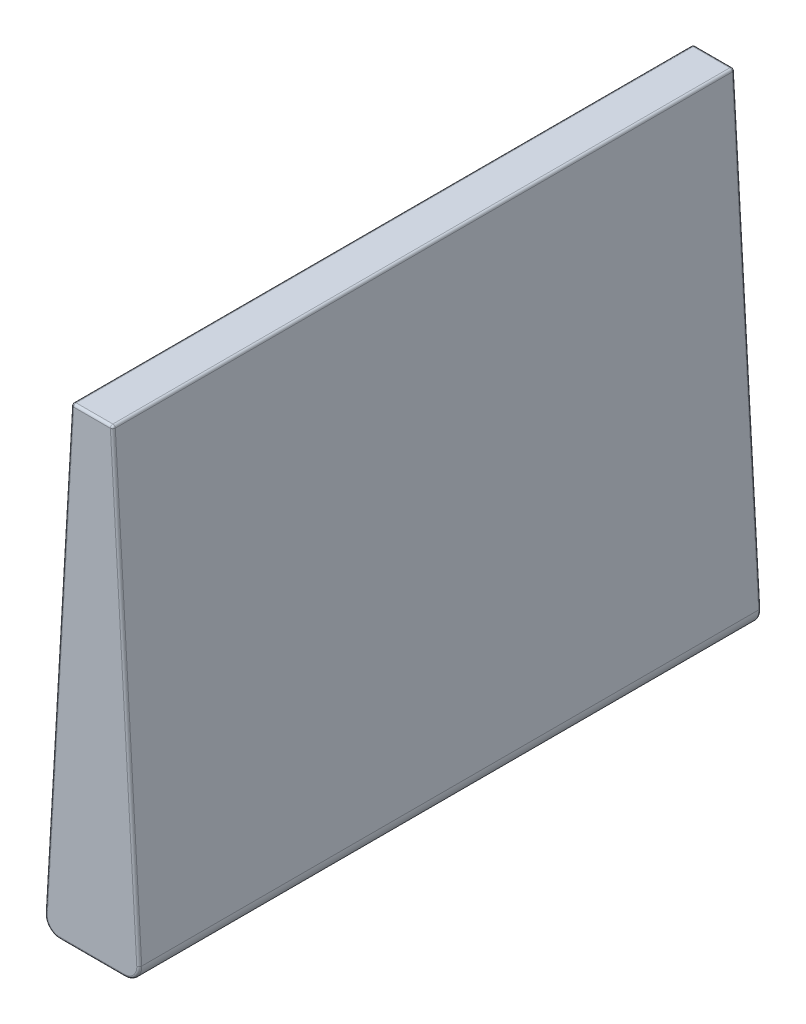
ISO-10303-21;
HEADER;
FILE_DESCRIPTION(('STEP AP214'),'2;1');
FILE_NAME('part.step','',(''),(''),'','','');
FILE_SCHEMA(('AUTOMOTIVE_DESIGN { 1 0 10303 214 1 1 1 1 }'));
ENDSEC;
DATA;
#1=APPLICATION_CONTEXT('core data for automotive mechanical design processes');
#2=APPLICATION_PROTOCOL_DEFINITION('international standard','automotive_design',2000,#1);
#3=PRODUCT_CONTEXT('',#1,'mechanical');
#4=PRODUCT('Part','Part','',(#3));
#5=PRODUCT_RELATED_PRODUCT_CATEGORY('part','',(#4));
#6=PRODUCT_DEFINITION_FORMATION('','',#4);
#7=PRODUCT_DEFINITION_CONTEXT('part definition',#1,'design');
#8=PRODUCT_DEFINITION('design','',#6,#7);
#9=PRODUCT_DEFINITION_SHAPE('','',#8);
#10=(LENGTH_UNIT() NAMED_UNIT(*) SI_UNIT(.MILLI.,.METRE.));
#11=(NAMED_UNIT(*) PLANE_ANGLE_UNIT() SI_UNIT($,.RADIAN.));
#12=(NAMED_UNIT(*) SI_UNIT($,.STERADIAN.) SOLID_ANGLE_UNIT());
#13=UNCERTAINTY_MEASURE_WITH_UNIT(LENGTH_MEASURE(1.E-05),#10,'distance_accuracy_value','');
#14=(GEOMETRIC_REPRESENTATION_CONTEXT(3) GLOBAL_UNCERTAINTY_ASSIGNED_CONTEXT((#13)) GLOBAL_UNIT_ASSIGNED_CONTEXT((#10,
#11,#12)) REPRESENTATION_CONTEXT('',''));
#15=CARTESIAN_POINT('',(0.,0.,0.));
#16=DIRECTION('',(0.,0.,1.));
#17=DIRECTION('',(1.,0.,0.));
#18=AXIS2_PLACEMENT_3D('',#15,#16,#17);
#19=CARTESIAN_POINT('',(454.302847130838,385.661126294718,239.77));
#20=DIRECTION('',(-1.,0.,0.));
#21=DIRECTION('',(0.,-1.,0.));
#22=AXIS2_PLACEMENT_3D('',#19,#20,#21);
#23=SPHERICAL_SURFACE('',#22,3.);
#24=CARTESIAN_POINT('',(454.302847130838,385.661126294718,239.77));
#25=DIRECTION('',(0.,0.,-1.));
#26=DIRECTION('',(-1.,0.,0.));
#27=AXIS2_PLACEMENT_3D('',#24,#25,#26);
#28=CIRCLE('',#27,3.);
#29=CARTESIAN_POINT('',(451.307938308074,385.835829309379,239.77));
#30=VERTEX_POINT('',#29);
#31=CARTESIAN_POINT('',(454.302847130838,388.661126294718,239.77));
#32=VERTEX_POINT('',#31);
#33=EDGE_CURVE('E129',#30,#32,#28,.T.);
#34=ORIENTED_EDGE('',*,*,#33,.F.);
#35=CARTESIAN_POINT('',(454.302847130838,385.661126294718,239.77));
#36=DIRECTION('',(0.0582343382204067,0.998302940921257,0.));
#37=DIRECTION('',(-0.998302940921257,0.0582343382204067,0.));
#38=AXIS2_PLACEMENT_3D('',#35,#36,#37);
#39=CIRCLE('',#38,3.);
#40=CARTESIAN_POINT('',(454.302847130838,385.661126294718,242.77));
#41=VERTEX_POINT('',#40);
#42=EDGE_CURVE('E20',#41,#30,#39,.F.);
#43=ORIENTED_EDGE('',*,*,#42,.F.);
#44=CARTESIAN_POINT('',(454.302847130838,385.661126294718,239.77));
#45=DIRECTION('',(-1.,0.,0.));
#46=DIRECTION('',(0.,0.,1.));
#47=AXIS2_PLACEMENT_3D('',#44,#45,#46);
#48=CIRCLE('',#47,3.);
#49=EDGE_CURVE('E117',#32,#41,#48,.F.);
#50=ORIENTED_EDGE('',*,*,#49,.F.);
#51=EDGE_LOOP('',(#34,#43,#50));
#52=FACE_BOUND('',#51,.T.);
#53=ADVANCED_FACE('F16',(#52),#23,.T.);
#54=CARTESIAN_POINT('',(454.302847130838,385.661126294718,-507.67));
#55=DIRECTION('',(-0.0582343382204347,-0.998302940921256,0.));
#56=DIRECTION('',(0.,0.,1.));
#57=AXIS2_PLACEMENT_3D('',#54,#55,#56);
#58=SPHERICAL_SURFACE('',#57,3.);
#59=CARTESIAN_POINT('',(454.302847130838,385.661126294718,-507.67));
#60=DIRECTION('',(1.,0.,0.));
#61=DIRECTION('',(0.,0.,-1.));
#62=AXIS2_PLACEMENT_3D('',#59,#60,#61);
#63=CIRCLE('',#62,3.);
#64=CARTESIAN_POINT('',(454.302847130838,385.661126294718,-510.67));
#65=VERTEX_POINT('',#64);
#66=CARTESIAN_POINT('',(454.302847130838,388.661126294718,-507.67));
#67=VERTEX_POINT('',#66);
#68=EDGE_CURVE('E265',#65,#67,#63,.T.);
#69=ORIENTED_EDGE('',*,*,#68,.F.);
#70=CARTESIAN_POINT('',(454.302847130838,385.661126294718,-507.67));
#71=DIRECTION('',(-0.0582343382204067,-0.998302940921257,0.));
#72=DIRECTION('',(0.998302940921257,-0.0582343382204067,0.));
#73=AXIS2_PLACEMENT_3D('',#70,#71,#72);
#74=CIRCLE('',#73,3.);
#75=CARTESIAN_POINT('',(451.307938308074,385.835829309379,-507.67));
#76=VERTEX_POINT('',#75);
#77=EDGE_CURVE('E266',#76,#65,#74,.T.);
#78=ORIENTED_EDGE('',*,*,#77,.F.);
#79=CARTESIAN_POINT('',(454.302847130838,385.661126294718,-507.67));
#80=DIRECTION('',(0.,0.,-1.));
#81=DIRECTION('',(-1.,0.,0.));
#82=AXIS2_PLACEMENT_3D('',#79,#80,#81);
#83=CIRCLE('',#82,3.);
#84=EDGE_CURVE('E280',#67,#76,#83,.F.);
#85=ORIENTED_EDGE('',*,*,#84,.F.);
#86=EDGE_LOOP('',(#69,#78,#85));
#87=FACE_BOUND('',#86,.T.);
#88=ADVANCED_FACE('F325',(#87),#58,.T.);
#89=CARTESIAN_POINT('',(451.510652388512,389.310927831157,-513.95));
#90=DIRECTION('',(0.998302940921257,-0.0582343382204067,0.));
#91=DIRECTION('',(0.0582343382204067,0.998302940921257,0.));
#92=AXIS2_PLACEMENT_3D('',#89,#90,#91);
#93=PLANE('',#92);
#94=DIRECTION('',(0.,0.,-1.));
#95=VECTOR('',#94,1.);
#96=CARTESIAN_POINT('',(451.307938308074,385.835829309379,-513.95));
#97=LINE('',#96,#95);
#98=EDGE_CURVE('E283',#76,#30,#97,.F.);
#99=ORIENTED_EDGE('',*,*,#98,.F.);
#100=DIRECTION('',(-0.0582343382204067,-0.998302940921257,0.));
#101=VECTOR('',#100,1.);
#102=CARTESIAN_POINT('',(434.772490193528,102.37100448859,-507.67));
#103=LINE('',#102,#101);
#104=CARTESIAN_POINT('',(419.31785168735,-162.565655617315,-507.67));
#105=VERTEX_POINT('',#104);
#106=EDGE_CURVE('E128',#105,#76,#103,.F.);
#107=ORIENTED_EDGE('',*,*,#106,.F.);
#108=DIRECTION('',(0.,0.,1.));
#109=VECTOR('',#108,1.);
#110=CARTESIAN_POINT('',(419.31785168735,-162.565655617315,-513.95));
#111=LINE('',#110,#109);
#112=CARTESIAN_POINT('',(419.31785168735,-162.565655617315,239.77));
#113=VERTEX_POINT('',#112);
#114=EDGE_CURVE('E314',#113,#105,#111,.F.);
#115=ORIENTED_EDGE('',*,*,#114,.F.);
#116=DIRECTION('',(0.0582343382204067,0.998302940921257,0.));
#117=VECTOR('',#116,1.);
#118=CARTESIAN_POINT('',(434.772490193528,102.37100448859,239.77));
#119=LINE('',#118,#117);
#120=EDGE_CURVE('E136',#30,#113,#119,.F.);
#121=ORIENTED_EDGE('',*,*,#120,.F.);
#122=EDGE_LOOP('',(#99,#107,#115,#121));
#123=FACE_BOUND('',#122,.T.);
#124=ADVANCED_FACE('F327',(#123),#93,.F.);
#125=CARTESIAN_POINT('',(437.767399016292,102.196301473929,239.77));
#126=DIRECTION('',(0.0582343382204067,0.998302940921257,0.));
#127=DIRECTION('',(-0.998302940921257,0.0582343382204067,0.));
#128=AXIS2_PLACEMENT_3D('',#125,#126,#127);
#129=CYLINDRICAL_SURFACE('',#128,3.);
#130=ORIENTED_EDGE('',*,*,#120,.T.);
#131=CARTESIAN_POINT('',(422.312760510114,-162.740358631976,239.77));
#132=DIRECTION('',(-0.0582343382204011,-0.998302940921258,0.));
#133=DIRECTION('',(-0.998302940921258,0.0582343382204011,0.));
#134=AXIS2_PLACEMENT_3D('',#131,#132,#133);
#135=CIRCLE('',#134,3.);
#136=CARTESIAN_POINT('',(422.312760510114,-162.740358631976,242.77));
#137=VERTEX_POINT('',#136);
#138=EDGE_CURVE('E149',#137,#113,#135,.T.);
#139=ORIENTED_EDGE('',*,*,#138,.F.);
#140=DIRECTION('',(-0.058234338220407,-0.998302940921257,0.));
#141=VECTOR('',#140,1.);
#142=CARTESIAN_POINT('',(454.302847130838,385.661126294718,242.77));
#143=LINE('',#142,#141);
#144=EDGE_CURVE('E139',#41,#137,#143,.T.);
#145=ORIENTED_EDGE('',*,*,#144,.F.);
#146=ORIENTED_EDGE('',*,*,#42,.T.);
#147=EDGE_LOOP('',(#130,#139,#145,#146));
#148=FACE_BOUND('',#147,.T.);
#149=ADVANCED_FACE('F147',(#148),#129,.T.);
#150=CARTESIAN_POINT('',(437.287304623933,-163.613873705282,239.77));
#151=DIRECTION('',(0.,0.,1.));
#152=DIRECTION('',(-1.,0.,0.));
#153=AXIS2_PLACEMENT_3D('',#150,#151,#152);
#154=TOROIDAL_SURFACE('',#153,15.,3.);
#155=CARTESIAN_POINT('',(437.287304623933,-163.613873705282,242.77));
#156=DIRECTION('',(0.,0.,-1.));
#157=DIRECTION('',(0.,-1.,0.));
#158=AXIS2_PLACEMENT_3D('',#155,#156,#157);
#159=CIRCLE('',#158,15.);
#160=CARTESIAN_POINT('',(437.287304623933,-178.613873705282,242.77));
#161=VERTEX_POINT('',#160);
#162=EDGE_CURVE('E152',#137,#161,#159,.F.);
#163=ORIENTED_EDGE('',*,*,#162,.F.);
#164=ORIENTED_EDGE('',*,*,#138,.T.);
#165=CARTESIAN_POINT('',(437.287304623933,-163.613873705282,239.77));
#166=DIRECTION('',(0.,0.,1.));
#167=DIRECTION('',(1.,0.,0.));
#168=AXIS2_PLACEMENT_3D('',#165,#166,#167);
#169=CIRCLE('',#168,18.);
#170=CARTESIAN_POINT('',(437.287304623933,-181.613873705282,239.77));
#171=VERTEX_POINT('',#170);
#172=EDGE_CURVE('E319',#171,#113,#169,.F.);
#173=ORIENTED_EDGE('',*,*,#172,.F.);
#174=CARTESIAN_POINT('',(437.287304623933,-178.613873705282,239.77));
#175=DIRECTION('',(1.,0.,0.));
#176=DIRECTION('',(0.,0.,-1.));
#177=AXIS2_PLACEMENT_3D('',#174,#175,#176);
#178=CIRCLE('',#177,3.);
#179=EDGE_CURVE('E160',#161,#171,#178,.T.);
#180=ORIENTED_EDGE('',*,*,#179,.F.);
#181=EDGE_LOOP('',(#163,#164,#173,#180));
#182=FACE_BOUND('',#181,.T.);
#183=ADVANCED_FACE('F294',(#182),#154,.T.);
#184=CARTESIAN_POINT('',(454.302847130838,385.661126294718,-513.95));
#185=DIRECTION('',(0.,0.,-1.));
#186=DIRECTION('',(-1.,0.,0.));
#187=AXIS2_PLACEMENT_3D('',#184,#185,#186);
#188=CYLINDRICAL_SURFACE('',#187,3.);
#189=ORIENTED_EDGE('',*,*,#33,.T.);
#190=DIRECTION('',(0.,0.,1.));
#191=VECTOR('',#190,1.);
#192=CARTESIAN_POINT('',(454.302847130838,388.661126294718,-133.95));
#193=LINE('',#192,#191);
#194=EDGE_CURVE('E144',#67,#32,#193,.T.);
#195=ORIENTED_EDGE('',*,*,#194,.F.);
#196=ORIENTED_EDGE('',*,*,#84,.T.);
#197=ORIENTED_EDGE('',*,*,#98,.T.);
#198=EDGE_LOOP('',(#189,#195,#196,#197));
#199=FACE_BOUND('',#198,.T.);
#200=ADVANCED_FACE('F299',(#199),#188,.T.);
#201=CARTESIAN_POINT('',(476.510652388512,385.661126294718,239.77));
#202=DIRECTION('',(-1.,0.,0.));
#203=DIRECTION('',(0.,0.,1.));
#204=AXIS2_PLACEMENT_3D('',#201,#202,#203);
#205=CYLINDRICAL_SURFACE('',#204,3.);
#206=CARTESIAN_POINT('',(498.718457646185,385.661126294718,239.77));
#207=DIRECTION('',(-1.,0.,0.));
#208=DIRECTION('',(0.,-1.,0.));
#209=AXIS2_PLACEMENT_3D('',#206,#207,#208);
#210=CIRCLE('',#209,3.);
#211=CARTESIAN_POINT('',(498.718457646185,388.661126294718,239.77));
#212=VERTEX_POINT('',#211);
#213=CARTESIAN_POINT('',(498.718457646185,385.661126294718,242.77));
#214=VERTEX_POINT('',#213);
#215=EDGE_CURVE('E418',#212,#214,#210,.F.);
#216=ORIENTED_EDGE('',*,*,#215,.F.);
#217=DIRECTION('',(1.,0.,0.));
#218=VECTOR('',#217,1.);
#219=CARTESIAN_POINT('',(495.010652388512,388.661126294718,239.77));
#220=LINE('',#219,#218);
#221=EDGE_CURVE('E124',#32,#212,#220,.T.);
#222=ORIENTED_EDGE('',*,*,#221,.F.);
#223=ORIENTED_EDGE('',*,*,#49,.T.);
#224=DIRECTION('',(1.,0.,0.));
#225=VECTOR('',#224,1.);
#226=CARTESIAN_POINT('',(510.956219503305,385.661126294718,242.77));
#227=LINE('',#226,#225);
#228=EDGE_CURVE('E122',#214,#41,#227,.F.);
#229=ORIENTED_EDGE('',*,*,#228,.F.);
#230=EDGE_LOOP('',(#216,#222,#223,#229));
#231=FACE_BOUND('',#230,.T.);
#232=ADVANCED_FACE('F120',(#231),#205,.T.);
#233=CARTESIAN_POINT('',(437.767399016292,102.196301473929,-507.67));
#234=DIRECTION('',(-0.0582343382204067,-0.998302940921257,0.));
#235=DIRECTION('',(0.998302940921257,-0.0582343382204067,0.));
#236=AXIS2_PLACEMENT_3D('',#233,#234,#235);
#237=CYLINDRICAL_SURFACE('',#236,3.);
#238=ORIENTED_EDGE('',*,*,#106,.T.);
#239=ORIENTED_EDGE('',*,*,#77,.T.);
#240=DIRECTION('',(0.058234338220407,0.998302940921257,0.));
#241=VECTOR('',#240,1.);
#242=CARTESIAN_POINT('',(422.312760510114,-162.740358631976,-510.67));
#243=LINE('',#242,#241);
#244=CARTESIAN_POINT('',(422.312760510114,-162.740358631976,-510.67));
#245=VERTEX_POINT('',#244);
#246=EDGE_CURVE('E414',#245,#65,#243,.T.);
#247=ORIENTED_EDGE('',*,*,#246,.F.);
#248=CARTESIAN_POINT('',(422.312760510114,-162.740358631976,-507.67));
#249=DIRECTION('',(-0.0582343382203922,-0.998302940921258,0.));
#250=DIRECTION('',(-0.998302940921258,0.0582343382203922,0.));
#251=AXIS2_PLACEMENT_3D('',#248,#249,#250);
#252=CIRCLE('',#251,3.);
#253=EDGE_CURVE('E257',#105,#245,#252,.T.);
#254=ORIENTED_EDGE('',*,*,#253,.F.);
#255=EDGE_LOOP('',(#238,#239,#247,#254));
#256=FACE_BOUND('',#255,.T.);
#257=ADVANCED_FACE('F250',(#256),#237,.T.);
#258=CARTESIAN_POINT('',(437.287304623933,-163.613873705282,-507.67));
#259=DIRECTION('',(0.,0.,1.));
#260=DIRECTION('',(-1.,0.,0.));
#261=AXIS2_PLACEMENT_3D('',#258,#259,#260);
#262=TOROIDAL_SURFACE('',#261,15.,3.);
#263=CARTESIAN_POINT('',(437.287304623933,-163.613873705282,-510.67));
#264=DIRECTION('',(0.,0.,1.));
#265=DIRECTION('',(-0.998302940921258,0.0582343382203918,0.));
#266=AXIS2_PLACEMENT_3D('',#263,#264,#265);
#267=CIRCLE('',#266,15.0000000000001);
#268=CARTESIAN_POINT('',(437.287304623933,-178.613873705282,-510.67));
#269=VERTEX_POINT('',#268);
#270=EDGE_CURVE('E410',#269,#245,#267,.F.);
#271=ORIENTED_EDGE('',*,*,#270,.F.);
#272=CARTESIAN_POINT('',(437.287304623933,-178.613873705282,-507.67));
#273=DIRECTION('',(-1.,0.,0.));
#274=DIRECTION('',(0.,0.,1.));
#275=AXIS2_PLACEMENT_3D('',#272,#273,#274);
#276=CIRCLE('',#275,3.);
#277=CARTESIAN_POINT('',(437.287304623933,-181.613873705282,-507.67));
#278=VERTEX_POINT('',#277);
#279=EDGE_CURVE('E153',#278,#269,#276,.F.);
#280=ORIENTED_EDGE('',*,*,#279,.F.);
#281=CARTESIAN_POINT('',(437.287304623933,-163.613873705282,-507.67));
#282=DIRECTION('',(0.,0.,1.));
#283=DIRECTION('',(1.,0.,0.));
#284=AXIS2_PLACEMENT_3D('',#281,#282,#283);
#285=CIRCLE('',#284,18.);
#286=EDGE_CURVE('E318',#105,#278,#285,.T.);
#287=ORIENTED_EDGE('',*,*,#286,.F.);
#288=ORIENTED_EDGE('',*,*,#253,.T.);
#289=EDGE_LOOP('',(#271,#280,#287,#288));
#290=FACE_BOUND('',#289,.T.);
#291=ADVANCED_FACE('F244',(#290),#262,.T.);
#292=CARTESIAN_POINT('',(476.510652388512,385.661126294718,-507.67));
#293=DIRECTION('',(1.,0.,0.));
#294=DIRECTION('',(0.,0.,-1.));
#295=AXIS2_PLACEMENT_3D('',#292,#293,#294);
#296=CYLINDRICAL_SURFACE('',#295,3.);
#297=ORIENTED_EDGE('',*,*,#68,.T.);
#298=DIRECTION('',(1.,0.,0.));
#299=VECTOR('',#298,1.);
#300=CARTESIAN_POINT('',(495.010652388512,388.661126294718,-507.67));
#301=LINE('',#300,#299);
#302=CARTESIAN_POINT('',(498.718457646185,388.661126294718,-507.67));
#303=VERTEX_POINT('',#302);
#304=EDGE_CURVE('E436',#303,#67,#301,.F.);
#305=ORIENTED_EDGE('',*,*,#304,.F.);
#306=CARTESIAN_POINT('',(498.718457646185,385.661126294718,-507.67));
#307=DIRECTION('',(1.,0.,0.));
#308=DIRECTION('',(0.,-1.,0.));
#309=AXIS2_PLACEMENT_3D('',#306,#307,#308);
#310=CIRCLE('',#309,3.);
#311=CARTESIAN_POINT('',(498.718457646186,385.66112629472,-510.67));
#312=VERTEX_POINT('',#311);
#313=EDGE_CURVE('E486',#312,#303,#310,.T.);
#314=ORIENTED_EDGE('',*,*,#313,.F.);
#315=DIRECTION('',(-1.,0.,0.));
#316=VECTOR('',#315,1.);
#317=CARTESIAN_POINT('',(442.065085273718,385.661126294718,-510.67));
#318=LINE('',#317,#316);
#319=EDGE_CURVE('E411',#65,#312,#318,.F.);
#320=ORIENTED_EDGE('',*,*,#319,.F.);
#321=EDGE_LOOP('',(#297,#305,#314,#320));
#322=FACE_BOUND('',#321,.T.);
#323=ADVANCED_FACE('F249',(#322),#296,.T.);
#324=CARTESIAN_POINT('',(437.287304623933,-163.613873705282,-513.95));
#325=DIRECTION('',(0.,0.,1.));
#326=DIRECTION('',(1.,0.,0.));
#327=AXIS2_PLACEMENT_3D('',#324,#325,#326);
#328=CYLINDRICAL_SURFACE('',#327,18.);
#329=ORIENTED_EDGE('',*,*,#286,.T.);
#330=DIRECTION('',(0.,0.,-1.));
#331=VECTOR('',#330,1.);
#332=CARTESIAN_POINT('',(437.287304623933,-181.613873705282,-133.95));
#333=LINE('',#332,#331);
#334=EDGE_CURVE('E235',#171,#278,#333,.T.);
#335=ORIENTED_EDGE('',*,*,#334,.F.);
#336=ORIENTED_EDGE('',*,*,#172,.T.);
#337=ORIENTED_EDGE('',*,*,#114,.T.);
#338=EDGE_LOOP('',(#329,#335,#336,#337));
#339=FACE_BOUND('',#338,.T.);
#340=ADVANCED_FACE('F590',(#339),#328,.T.);
#341=CARTESIAN_POINT('',(476.510652388512,-178.613873705282,239.77));
#342=DIRECTION('',(1.,0.,0.));
#343=DIRECTION('',(0.,0.,-1.));
#344=AXIS2_PLACEMENT_3D('',#341,#342,#343);
#345=CYLINDRICAL_SURFACE('',#344,3.);
#346=DIRECTION('',(1.,0.,0.));
#347=VECTOR('',#346,1.);
#348=CARTESIAN_POINT('',(447.804380484607,-181.613873705282,239.77));
#349=LINE('',#348,#347);
#350=CARTESIAN_POINT('',(515.73400015309,-181.613873705282,239.77));
#351=VERTEX_POINT('',#350);
#352=EDGE_CURVE('E490',#351,#171,#349,.F.);
#353=ORIENTED_EDGE('',*,*,#352,.F.);
#354=CARTESIAN_POINT('',(515.73400015309,-178.613873705282,239.77));
#355=DIRECTION('',(1.,0.,0.));
#356=DIRECTION('',(0.,-1.,0.));
#357=AXIS2_PLACEMENT_3D('',#354,#355,#356);
#358=CIRCLE('',#357,3.);
#359=CARTESIAN_POINT('',(515.73400015309,-178.613873705282,242.77));
#360=VERTEX_POINT('',#359);
#361=EDGE_CURVE('E227',#360,#351,#358,.T.);
#362=ORIENTED_EDGE('',*,*,#361,.F.);
#363=DIRECTION('',(1.,0.,0.));
#364=VECTOR('',#363,1.);
#365=CARTESIAN_POINT('',(510.956219503305,-178.613873705282,242.77));
#366=LINE('',#365,#364);
#367=EDGE_CURVE('E145',#161,#360,#366,.T.);
#368=ORIENTED_EDGE('',*,*,#367,.F.);
#369=ORIENTED_EDGE('',*,*,#179,.T.);
#370=EDGE_LOOP('',(#353,#362,#368,#369));
#371=FACE_BOUND('',#370,.T.);
#372=ADVANCED_FACE('F488',(#371),#345,.T.);
#373=CARTESIAN_POINT('',(476.510652388512,-178.613873705282,-507.67));
#374=DIRECTION('',(-1.,0.,0.));
#375=DIRECTION('',(0.,0.,1.));
#376=AXIS2_PLACEMENT_3D('',#373,#374,#375);
#377=CYLINDRICAL_SURFACE('',#376,3.);
#378=DIRECTION('',(1.,0.,0.));
#379=VECTOR('',#378,1.);
#380=CARTESIAN_POINT('',(447.804380484607,-181.613873705282,-507.67));
#381=LINE('',#380,#379);
#382=CARTESIAN_POINT('',(515.73400015309,-181.613873705282,-507.67));
#383=VERTEX_POINT('',#382);
#384=EDGE_CURVE('E497',#278,#383,#381,.T.);
#385=ORIENTED_EDGE('',*,*,#384,.F.);
#386=ORIENTED_EDGE('',*,*,#279,.T.);
#387=DIRECTION('',(-1.,0.,0.));
#388=VECTOR('',#387,1.);
#389=CARTESIAN_POINT('',(442.065085273718,-178.613873705282,-510.67));
#390=LINE('',#389,#388);
#391=CARTESIAN_POINT('',(515.73400015309,-178.613873705282,-510.67));
#392=VERTEX_POINT('',#391);
#393=EDGE_CURVE('E402',#392,#269,#390,.T.);
#394=ORIENTED_EDGE('',*,*,#393,.F.);
#395=CARTESIAN_POINT('',(515.73400015309,-178.613873705282,-507.67));
#396=DIRECTION('',(1.,0.,0.));
#397=DIRECTION('',(0.,-1.,0.));
#398=AXIS2_PLACEMENT_3D('',#395,#396,#397);
#399=CIRCLE('',#398,3.);
#400=EDGE_CURVE('E188',#383,#392,#399,.T.);
#401=ORIENTED_EDGE('',*,*,#400,.F.);
#402=EDGE_LOOP('',(#385,#386,#394,#401));
#403=FACE_BOUND('',#402,.T.);
#404=ADVANCED_FACE('F468',(#403),#377,.T.);
#405=CARTESIAN_POINT('',(510.956219503305,110.210927831157,242.77));
#406=DIRECTION('',(0.,0.,1.));
#407=DIRECTION('',(1.,0.,0.));
#408=AXIS2_PLACEMENT_3D('',#405,#406,#407);
#409=PLANE('',#408);
#410=DIRECTION('',(0.0582343382204067,-0.998302940921257,0.));
#411=VECTOR('',#410,1.);
#412=CARTESIAN_POINT('',(515.253905760731,102.196301473929,242.77));
#413=LINE('',#412,#411);
#414=CARTESIAN_POINT('',(530.708544266909,-162.740358631976,242.77));
#415=VERTEX_POINT('',#414);
#416=EDGE_CURVE('E142',#214,#415,#413,.T.);
#417=ORIENTED_EDGE('',*,*,#416,.F.);
#418=ORIENTED_EDGE('',*,*,#228,.T.);
#419=ORIENTED_EDGE('',*,*,#144,.T.);
#420=ORIENTED_EDGE('',*,*,#162,.T.);
#421=ORIENTED_EDGE('',*,*,#367,.T.);
#422=CARTESIAN_POINT('',(515.73400015309,-163.613873705282,242.77));
#423=DIRECTION('',(0.,0.,-1.));
#424=DIRECTION('',(0.998302940921258,0.0582343382203965,0.));
#425=AXIS2_PLACEMENT_3D('',#422,#423,#424);
#426=CIRCLE('',#425,15.0000000000003);
#427=EDGE_CURVE('E236',#415,#360,#426,.T.);
#428=ORIENTED_EDGE('',*,*,#427,.F.);
#429=EDGE_LOOP('',(#417,#418,#419,#420,#421,#428));
#430=FACE_BOUND('',#429,.T.);
#431=ADVANCED_FACE('F138',(#430),#409,.T.);
#432=CARTESIAN_POINT('',(495.010652388512,388.661126294718,-133.95));
#433=DIRECTION('',(0.,1.,0.));
#434=DIRECTION('',(0.,0.,1.));
#435=AXIS2_PLACEMENT_3D('',#432,#433,#434);
#436=PLANE('',#435);
#437=DIRECTION('',(0.,0.,1.));
#438=VECTOR('',#437,1.);
#439=CARTESIAN_POINT('',(498.718457646185,388.661126294718,-513.95));
#440=LINE('',#439,#438);
#441=EDGE_CURVE('E176',#303,#212,#440,.T.);
#442=ORIENTED_EDGE('',*,*,#441,.F.);
#443=ORIENTED_EDGE('',*,*,#304,.T.);
#444=ORIENTED_EDGE('',*,*,#194,.T.);
#445=ORIENTED_EDGE('',*,*,#221,.T.);
#446=EDGE_LOOP('',(#442,#443,#444,#445));
#447=FACE_BOUND('',#446,.T.);
#448=ADVANCED_FACE('F467',(#447),#436,.T.);
#449=CARTESIAN_POINT('',(498.718457646185,385.661126294718,239.77));
#450=DIRECTION('',(-1.,0.,0.));
#451=DIRECTION('',(0.,-1.,0.));
#452=AXIS2_PLACEMENT_3D('',#449,#450,#451);
#453=SPHERICAL_SURFACE('',#452,3.);
#454=CARTESIAN_POINT('',(498.718457646185,385.661126294718,239.77));
#455=DIRECTION('',(0.,0.,1.));
#456=DIRECTION('',(1.,0.,0.));
#457=AXIS2_PLACEMENT_3D('',#454,#455,#456);
#458=CIRCLE('',#457,3.);
#459=CARTESIAN_POINT('',(501.713366468949,385.835829309379,239.77));
#460=VERTEX_POINT('',#459);
#461=EDGE_CURVE('E363',#212,#460,#458,.F.);
#462=ORIENTED_EDGE('',*,*,#461,.F.);
#463=ORIENTED_EDGE('',*,*,#215,.T.);
#464=CARTESIAN_POINT('',(498.718457646185,385.661126294718,239.77));
#465=DIRECTION('',(0.0582343382204067,-0.998302940921257,0.));
#466=DIRECTION('',(0.998302940921257,0.0582343382204067,0.));
#467=AXIS2_PLACEMENT_3D('',#464,#465,#466);
#468=CIRCLE('',#467,3.);
#469=EDGE_CURVE('E171',#460,#214,#468,.T.);
#470=ORIENTED_EDGE('',*,*,#469,.F.);
#471=EDGE_LOOP('',(#462,#463,#470));
#472=FACE_BOUND('',#471,.T.);
#473=ADVANCED_FACE('F395',(#472),#453,.T.);
#474=CARTESIAN_POINT('',(442.065085273718,110.210927831157,-510.67));
#475=DIRECTION('',(0.,0.,-1.));
#476=DIRECTION('',(-1.,0.,0.));
#477=AXIS2_PLACEMENT_3D('',#474,#475,#476);
#478=PLANE('',#477);
#479=ORIENTED_EDGE('',*,*,#393,.T.);
#480=ORIENTED_EDGE('',*,*,#270,.T.);
#481=ORIENTED_EDGE('',*,*,#246,.T.);
#482=ORIENTED_EDGE('',*,*,#319,.T.);
#483=DIRECTION('',(-0.0582343382204067,0.998302940921257,0.));
#484=VECTOR('',#483,1.);
#485=CARTESIAN_POINT('',(515.253905760731,102.196301473929,-510.67));
#486=LINE('',#485,#484);
#487=CARTESIAN_POINT('',(530.708544266909,-162.740358631976,-510.67));
#488=VERTEX_POINT('',#487);
#489=EDGE_CURVE('E538',#488,#312,#486,.T.);
#490=ORIENTED_EDGE('',*,*,#489,.F.);
#491=CARTESIAN_POINT('',(515.73400015309,-163.613873705282,-510.67));
#492=DIRECTION('',(0.,0.,1.));
#493=DIRECTION('',(0.,-1.,0.));
#494=AXIS2_PLACEMENT_3D('',#491,#492,#493);
#495=CIRCLE('',#494,15.);
#496=EDGE_CURVE('E182',#392,#488,#495,.T.);
#497=ORIENTED_EDGE('',*,*,#496,.F.);
#498=EDGE_LOOP('',(#479,#480,#481,#482,#490,#497));
#499=FACE_BOUND('',#498,.T.);
#500=ADVANCED_FACE('F386',(#499),#478,.T.);
#501=CARTESIAN_POINT('',(498.718457646185,385.661126294718,-507.67));
#502=DIRECTION('',(1.,0.,0.));
#503=DIRECTION('',(0.,-1.,0.));
#504=AXIS2_PLACEMENT_3D('',#501,#502,#503);
#505=SPHERICAL_SURFACE('',#504,3.);
#506=CARTESIAN_POINT('',(498.718457646185,385.661126294718,-507.67));
#507=DIRECTION('',(0.,0.,1.));
#508=DIRECTION('',(1.,0.,0.));
#509=AXIS2_PLACEMENT_3D('',#506,#507,#508);
#510=CIRCLE('',#509,3.);
#511=CARTESIAN_POINT('',(501.713366468949,385.835829309379,-507.67));
#512=VERTEX_POINT('',#511);
#513=EDGE_CURVE('E360',#512,#303,#510,.T.);
#514=ORIENTED_EDGE('',*,*,#513,.F.);
#515=CARTESIAN_POINT('',(498.718457646185,385.661126294718,-507.67));
#516=DIRECTION('',(-0.0582343382204067,0.998302940921257,0.));
#517=DIRECTION('',(-0.998302940921257,-0.0582343382204067,0.));
#518=AXIS2_PLACEMENT_3D('',#515,#516,#517);
#519=CIRCLE('',#518,3.);
#520=EDGE_CURVE('E424',#312,#512,#519,.F.);
#521=ORIENTED_EDGE('',*,*,#520,.F.);
#522=ORIENTED_EDGE('',*,*,#313,.T.);
#523=EDGE_LOOP('',(#514,#521,#522));
#524=FACE_BOUND('',#523,.T.);
#525=ADVANCED_FACE('F217',(#524),#505,.T.);
#526=CARTESIAN_POINT('',(515.73400015309,-163.613873705282,239.77));
#527=DIRECTION('',(0.,0.,1.));
#528=DIRECTION('',(-1.,0.,0.));
#529=AXIS2_PLACEMENT_3D('',#526,#527,#528);
#530=TOROIDAL_SURFACE('',#529,15.0000000000001,3.);
#531=ORIENTED_EDGE('',*,*,#427,.T.);
#532=ORIENTED_EDGE('',*,*,#361,.T.);
#533=CARTESIAN_POINT('',(515.73400015309,-163.613873705282,239.77));
#534=DIRECTION('',(0.,0.,1.));
#535=DIRECTION('',(1.,0.,0.));
#536=AXIS2_PLACEMENT_3D('',#533,#534,#535);
#537=CIRCLE('',#536,18.);
#538=CARTESIAN_POINT('',(533.703453089673,-162.565655617315,239.77));
#539=VERTEX_POINT('',#538);
#540=EDGE_CURVE('E208',#539,#351,#537,.F.);
#541=ORIENTED_EDGE('',*,*,#540,.F.);
#542=CARTESIAN_POINT('',(530.708544266909,-162.740358631976,239.77));
#543=DIRECTION('',(0.0582343382204067,-0.998302940921257,0.));
#544=DIRECTION('',(0.998302940921257,0.0582343382204067,0.));
#545=AXIS2_PLACEMENT_3D('',#542,#543,#544);
#546=CIRCLE('',#545,3.);
#547=EDGE_CURVE('E170',#415,#539,#546,.F.);
#548=ORIENTED_EDGE('',*,*,#547,.F.);
#549=EDGE_LOOP('',(#531,#532,#541,#548));
#550=FACE_BOUND('',#549,.T.);
#551=ADVANCED_FACE('F213',(#550),#530,.T.);
#552=CARTESIAN_POINT('',(447.804380484607,-181.613873705282,-133.95));
#553=DIRECTION('',(0.,-1.,0.));
#554=DIRECTION('',(0.,0.,-1.));
#555=AXIS2_PLACEMENT_3D('',#552,#553,#554);
#556=PLANE('',#555);
#557=DIRECTION('',(0.,0.,1.));
#558=VECTOR('',#557,1.);
#559=CARTESIAN_POINT('',(515.73400015309,-181.613873705282,-513.95));
#560=LINE('',#559,#558);
#561=EDGE_CURVE('E499',#351,#383,#560,.F.);
#562=ORIENTED_EDGE('',*,*,#561,.F.);
#563=ORIENTED_EDGE('',*,*,#352,.T.);
#564=ORIENTED_EDGE('',*,*,#334,.T.);
#565=ORIENTED_EDGE('',*,*,#384,.T.);
#566=EDGE_LOOP('',(#562,#563,#564,#565));
#567=FACE_BOUND('',#566,.T.);
#568=ADVANCED_FACE('F202',(#567),#556,.T.);
#569=CARTESIAN_POINT('',(515.73400015309,-163.613873705282,-507.67));
#570=DIRECTION('',(0.,0.,1.));
#571=DIRECTION('',(-1.,0.,0.));
#572=AXIS2_PLACEMENT_3D('',#569,#570,#571);
#573=TOROIDAL_SURFACE('',#572,15.0000000000001,3.);
#574=ORIENTED_EDGE('',*,*,#496,.T.);
#575=CARTESIAN_POINT('',(530.708544266909,-162.740358631976,-507.67));
#576=DIRECTION('',(-0.0582343382204067,0.998302940921257,0.));
#577=DIRECTION('',(-0.998302940921257,-0.0582343382204067,0.));
#578=AXIS2_PLACEMENT_3D('',#575,#576,#577);
#579=CIRCLE('',#578,3.);
#580=CARTESIAN_POINT('',(533.703453089673,-162.565655617315,-507.67));
#581=VERTEX_POINT('',#580);
#582=EDGE_CURVE('E421',#581,#488,#579,.T.);
#583=ORIENTED_EDGE('',*,*,#582,.F.);
#584=CARTESIAN_POINT('',(515.73400015309,-163.613873705282,-507.67));
#585=DIRECTION('',(0.,0.,1.));
#586=DIRECTION('',(1.,0.,0.));
#587=AXIS2_PLACEMENT_3D('',#584,#585,#586);
#588=CIRCLE('',#587,18.);
#589=EDGE_CURVE('E35',#383,#581,#588,.T.);
#590=ORIENTED_EDGE('',*,*,#589,.F.);
#591=ORIENTED_EDGE('',*,*,#400,.T.);
#592=EDGE_LOOP('',(#574,#583,#590,#591));
#593=FACE_BOUND('',#592,.T.);
#594=ADVANCED_FACE('F190',(#593),#573,.T.);
#595=CARTESIAN_POINT('',(515.253905760731,102.196301473929,239.77));
#596=DIRECTION('',(0.0582343382204067,-0.998302940921257,0.));
#597=DIRECTION('',(0.998302940921257,0.0582343382204067,0.));
#598=AXIS2_PLACEMENT_3D('',#595,#596,#597);
#599=CYLINDRICAL_SURFACE('',#598,3.);
#600=ORIENTED_EDGE('',*,*,#547,.T.);
#601=DIRECTION('',(0.0582343382204067,-0.998302940921257,0.));
#602=VECTOR('',#601,1.);
#603=CARTESIAN_POINT('',(536.510652388512,-210.689072168843,239.77));
#604=LINE('',#603,#602);
#605=EDGE_CURVE('E368',#539,#460,#604,.F.);
#606=ORIENTED_EDGE('',*,*,#605,.T.);
#607=ORIENTED_EDGE('',*,*,#469,.T.);
#608=ORIENTED_EDGE('',*,*,#416,.T.);
#609=EDGE_LOOP('',(#600,#606,#607,#608));
#610=FACE_BOUND('',#609,.T.);
#611=ADVANCED_FACE('F201',(#610),#599,.T.);
#612=CARTESIAN_POINT('',(498.718457646185,385.661126294718,-513.95));
#613=DIRECTION('',(0.,0.,1.));
#614=DIRECTION('',(1.,0.,0.));
#615=AXIS2_PLACEMENT_3D('',#612,#613,#614);
#616=CYLINDRICAL_SURFACE('',#615,3.);
#617=DIRECTION('',(0.,0.,1.));
#618=VECTOR('',#617,1.);
#619=CARTESIAN_POINT('',(501.713366468949,385.835829309379,-513.95));
#620=LINE('',#619,#618);
#621=EDGE_CURVE('E357',#460,#512,#620,.F.);
#622=ORIENTED_EDGE('',*,*,#621,.T.);
#623=ORIENTED_EDGE('',*,*,#513,.T.);
#624=ORIENTED_EDGE('',*,*,#441,.T.);
#625=ORIENTED_EDGE('',*,*,#461,.T.);
#626=EDGE_LOOP('',(#622,#623,#624,#625));
#627=FACE_BOUND('',#626,.T.);
#628=ADVANCED_FACE('F347',(#627),#616,.T.);
#629=CARTESIAN_POINT('',(515.253905760731,102.196301473929,-507.67));
#630=DIRECTION('',(-0.0582343382204067,0.998302940921257,0.));
#631=DIRECTION('',(-0.998302940921257,-0.0582343382204067,0.));
#632=AXIS2_PLACEMENT_3D('',#629,#630,#631);
#633=CYLINDRICAL_SURFACE('',#632,3.);
#634=DIRECTION('',(0.0582343382204067,-0.998302940921257,0.));
#635=VECTOR('',#634,1.);
#636=CARTESIAN_POINT('',(536.510652388512,-210.689072168843,-507.67));
#637=LINE('',#636,#635);
#638=EDGE_CURVE('E27',#512,#581,#637,.T.);
#639=ORIENTED_EDGE('',*,*,#638,.T.);
#640=ORIENTED_EDGE('',*,*,#582,.T.);
#641=ORIENTED_EDGE('',*,*,#489,.T.);
#642=ORIENTED_EDGE('',*,*,#520,.T.);
#643=EDGE_LOOP('',(#639,#640,#641,#642));
#644=FACE_BOUND('',#643,.T.);
#645=ADVANCED_FACE('F342',(#644),#633,.T.);
#646=CARTESIAN_POINT('',(515.73400015309,-163.613873705282,-513.95));
#647=DIRECTION('',(0.,0.,1.));
#648=DIRECTION('',(1.,0.,0.));
#649=AXIS2_PLACEMENT_3D('',#646,#647,#648);
#650=CYLINDRICAL_SURFACE('',#649,18.);
#651=ORIENTED_EDGE('',*,*,#589,.T.);
#652=DIRECTION('',(0.,0.,1.));
#653=VECTOR('',#652,1.);
#654=CARTESIAN_POINT('',(533.703453089673,-162.565655617315,-513.95));
#655=LINE('',#654,#653);
#656=EDGE_CURVE('E11',#581,#539,#655,.T.);
#657=ORIENTED_EDGE('',*,*,#656,.T.);
#658=ORIENTED_EDGE('',*,*,#540,.T.);
#659=ORIENTED_EDGE('',*,*,#561,.T.);
#660=EDGE_LOOP('',(#651,#657,#658,#659));
#661=FACE_BOUND('',#660,.T.);
#662=ADVANCED_FACE('F337',(#661),#650,.T.);
#663=CARTESIAN_POINT('',(536.510652388512,-210.689072168843,-513.95));
#664=DIRECTION('',(-0.998302940921257,-0.0582343382204067,0.));
#665=DIRECTION('',(0.0582343382204067,-0.998302940921257,0.));
#666=AXIS2_PLACEMENT_3D('',#663,#664,#665);
#667=PLANE('',#666);
#668=ORIENTED_EDGE('',*,*,#638,.F.);
#669=ORIENTED_EDGE('',*,*,#621,.F.);
#670=ORIENTED_EDGE('',*,*,#605,.F.);
#671=ORIENTED_EDGE('',*,*,#656,.F.);
#672=EDGE_LOOP('',(#668,#669,#670,#671));
#673=FACE_BOUND('',#672,.T.);
#674=ADVANCED_FACE('F335',(#673),#667,.F.);
#675=CLOSED_SHELL('',(#53,#88,#124,#149,#183,#200,#232,#257,#291,#323,#340,#372,#404,#431,#448,
#473,#500,#525,#551,#568,#594,#611,#628,#645,#662,#674));
#676=MANIFOLD_SOLID_BREP('B1',#675);
#677=ADVANCED_BREP_SHAPE_REPRESENTATION('',(#18,#676),#14);
#678=SHAPE_DEFINITION_REPRESENTATION(#9,#677);
ENDSEC;
END-ISO-10303-21;
